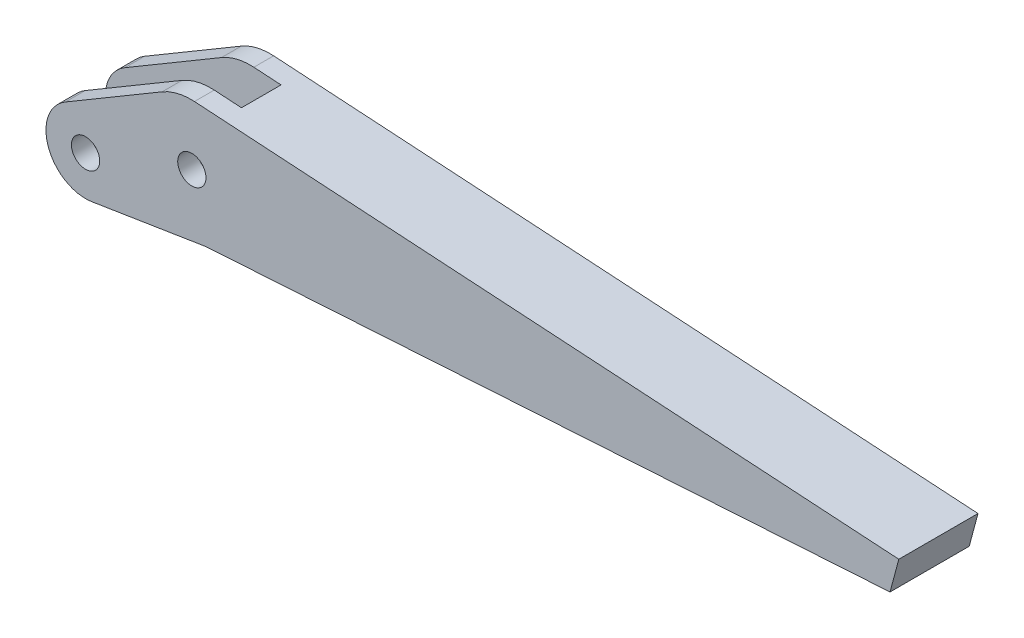
ISO-10303-21;
HEADER;
FILE_DESCRIPTION(('STEP AP214'),'2;1');
FILE_NAME('part.step','',(''),(''),'','','');
FILE_SCHEMA(('AUTOMOTIVE_DESIGN { 1 0 10303 214 1 1 1 1 }'));
ENDSEC;
DATA;
#1=APPLICATION_CONTEXT('core data for automotive mechanical design processes');
#2=APPLICATION_PROTOCOL_DEFINITION('international standard','automotive_design',2000,#1);
#3=PRODUCT_CONTEXT('',#1,'mechanical');
#4=PRODUCT('Part','Part','',(#3));
#5=PRODUCT_RELATED_PRODUCT_CATEGORY('part','',(#4));
#6=PRODUCT_DEFINITION_FORMATION('','',#4);
#7=PRODUCT_DEFINITION_CONTEXT('part definition',#1,'design');
#8=PRODUCT_DEFINITION('design','',#6,#7);
#9=PRODUCT_DEFINITION_SHAPE('','',#8);
#10=(LENGTH_UNIT() NAMED_UNIT(*) SI_UNIT(.MILLI.,.METRE.));
#11=(NAMED_UNIT(*) PLANE_ANGLE_UNIT() SI_UNIT($,.RADIAN.));
#12=(NAMED_UNIT(*) SI_UNIT($,.STERADIAN.) SOLID_ANGLE_UNIT());
#13=UNCERTAINTY_MEASURE_WITH_UNIT(LENGTH_MEASURE(1.E-05),#10,'distance_accuracy_value','');
#14=(GEOMETRIC_REPRESENTATION_CONTEXT(3) GLOBAL_UNCERTAINTY_ASSIGNED_CONTEXT((#13)) GLOBAL_UNIT_ASSIGNED_CONTEXT((#10,
#11,#12)) REPRESENTATION_CONTEXT('',''));
#15=CARTESIAN_POINT('',(0.,0.,0.));
#16=DIRECTION('',(0.,0.,1.));
#17=DIRECTION('',(1.,0.,0.));
#18=AXIS2_PLACEMENT_3D('',#15,#16,#17);
#19=CARTESIAN_POINT('',(-11.1776244543759,-0.407044657572463,7.));
#20=DIRECTION('',(0.508770927576245,-0.86090193590978,0.));
#21=DIRECTION('',(0.86090193590978,0.508770927576245,0.));
#22=AXIS2_PLACEMENT_3D('',#19,#20,#21);
#23=PLANE('',#22);
#24=DIRECTION('',(0.86090193590978,0.508770927576245,0.));
#25=VECTOR('',#24,1.);
#26=CARTESIAN_POINT('',(-11.1776244543759,-0.407044657572463,1.75));
#27=LINE('',#26,#25);
#28=CARTESIAN_POINT('',(-11.1776244543759,-0.407044657572463,1.75));
#29=VERTEX_POINT('',#28);
#30=CARTESIAN_POINT('',(-2.62599056397553,4.64675128042089,1.75));
#31=VERTEX_POINT('',#30);
#32=EDGE_CURVE('E177',#29,#31,#27,.T.);
#33=ORIENTED_EDGE('',*,*,#32,.T.);
#34=DIRECTION('',(0.,0.,-1.));
#35=VECTOR('',#34,1.);
#36=CARTESIAN_POINT('',(-2.62599056397554,4.64675128042089,7.));
#37=LINE('',#36,#35);
#38=CARTESIAN_POINT('',(-2.62599056397554,4.64675128042089,0.));
#39=VERTEX_POINT('',#38);
#40=EDGE_CURVE('E262',#31,#39,#37,.T.);
#41=ORIENTED_EDGE('',*,*,#40,.T.);
#42=DIRECTION('',(-0.86090193590978,-0.508770927576245,0.));
#43=VECTOR('',#42,1.);
#44=CARTESIAN_POINT('',(-11.1776244543759,-0.407044657572463,0.));
#45=LINE('',#44,#43);
#46=CARTESIAN_POINT('',(-11.1776244543759,-0.407044657572463,0.));
#47=VERTEX_POINT('',#46);
#48=EDGE_CURVE('E212',#39,#47,#45,.T.);
#49=ORIENTED_EDGE('',*,*,#48,.T.);
#50=DIRECTION('',(0.,0.,-1.));
#51=VECTOR('',#50,1.);
#52=CARTESIAN_POINT('',(-11.1776244543759,-0.407044657572463,7.));
#53=LINE('',#52,#51);
#54=EDGE_CURVE('E227',#29,#47,#53,.T.);
#55=ORIENTED_EDGE('',*,*,#54,.F.);
#56=EDGE_LOOP('',(#33,#41,#49,#55));
#57=FACE_BOUND('',#56,.T.);
#58=ADVANCED_FACE('F32',(#57),#23,.F.);
#59=CARTESIAN_POINT('',(-9.39692620785908,-3.42020143325669,7.));
#60=DIRECTION('',(0.,0.,-1.));
#61=DIRECTION('',(-1.,0.,0.));
#62=AXIS2_PLACEMENT_3D('',#59,#60,#61);
#63=CYLINDRICAL_SURFACE('',#62,3.5);
#64=DIRECTION('',(0.,0.,-1.));
#65=VECTOR('',#64,1.);
#66=CARTESIAN_POINT('',(-8.84684112469676,-6.8767034803098,7.));
#67=LINE('',#66,#65);
#68=CARTESIAN_POINT('',(-8.84684112469676,-6.8767034803098,1.75));
#69=VERTEX_POINT('',#68);
#70=CARTESIAN_POINT('',(-8.84684112469676,-6.8767034803098,0.));
#71=VERTEX_POINT('',#70);
#72=EDGE_CURVE('E223',#69,#71,#67,.T.);
#73=ORIENTED_EDGE('',*,*,#72,.F.);
#74=CARTESIAN_POINT('',(-9.39692620785908,-3.42020143325669,1.75));
#75=DIRECTION('',(0.,0.,-1.));
#76=DIRECTION('',(-1.,0.,0.));
#77=AXIS2_PLACEMENT_3D('',#74,#75,#76);
#78=CIRCLE('',#77,3.5);
#79=EDGE_CURVE('E295',#69,#29,#78,.T.);
#80=ORIENTED_EDGE('',*,*,#79,.T.);
#81=ORIENTED_EDGE('',*,*,#54,.T.);
#82=CARTESIAN_POINT('',(-9.39692620785908,-3.42020143325669,0.));
#83=DIRECTION('',(0.,0.,1.));
#84=DIRECTION('',(1.,0.,0.));
#85=AXIS2_PLACEMENT_3D('',#82,#83,#84);
#86=CIRCLE('',#85,3.5);
#87=EDGE_CURVE('E214',#47,#71,#86,.T.);
#88=ORIENTED_EDGE('',*,*,#87,.T.);
#89=EDGE_LOOP('',(#73,#80,#81,#88));
#90=FACE_BOUND('',#89,.T.);
#91=ADVANCED_FACE('F340',(#90),#63,.T.);
#92=CARTESIAN_POINT('',(1.26418836332578,-5.26758350263832,7.));
#93=DIRECTION('',(-0.157167166617804,0.987572013443744,0.));
#94=DIRECTION('',(-0.987572013443745,-0.157167166617804,0.));
#95=AXIS2_PLACEMENT_3D('',#92,#93,#94);
#96=PLANE('',#95);
#97=DIRECTION('',(0.987572013443744,0.157167166617804,0.));
#98=VECTOR('',#97,1.);
#99=CARTESIAN_POINT('',(1.26418836332578,-5.26758350263832,0.));
#100=LINE('',#99,#98);
#101=CARTESIAN_POINT('',(1.029108184364,-5.30499534213202,0.));
#102=VERTEX_POINT('',#101);
#103=EDGE_CURVE('E217',#71,#102,#100,.T.);
#104=ORIENTED_EDGE('',*,*,#103,.T.);
#105=DIRECTION('',(0.,0.,-1.));
#106=VECTOR('',#105,1.);
#107=CARTESIAN_POINT('',(1.029108184364,-5.30499534213202,1.75));
#108=LINE('',#107,#106);
#109=CARTESIAN_POINT('',(1.029108184364,-5.30499534213202,1.75));
#110=VERTEX_POINT('',#109);
#111=EDGE_CURVE('E250',#102,#110,#108,.F.);
#112=ORIENTED_EDGE('',*,*,#111,.T.);
#113=DIRECTION('',(-0.987572013443744,-0.157167166617804,0.));
#114=VECTOR('',#113,1.);
#115=CARTESIAN_POINT('',(1.26418836332578,-5.26758350263832,1.75));
#116=LINE('',#115,#114);
#117=EDGE_CURVE('E290',#110,#69,#116,.T.);
#118=ORIENTED_EDGE('',*,*,#117,.T.);
#119=ORIENTED_EDGE('',*,*,#72,.T.);
#120=EDGE_LOOP('',(#104,#112,#118,#119));
#121=FACE_BOUND('',#120,.T.);
#122=ADVANCED_FACE('F281',(#121),#96,.F.);
#123=CARTESIAN_POINT('',(0.,0.,7.));
#124=DIRECTION('',(0.,0.,-1.));
#125=DIRECTION('',(-1.,0.,0.));
#126=AXIS2_PLACEMENT_3D('',#123,#124,#125);
#127=CYLINDRICAL_SURFACE('',#126,1.25);
#128=CARTESIAN_POINT('',(0.,0.,1.75));
#129=DIRECTION('',(0.,0.,-1.));
#130=DIRECTION('',(-1.,0.,0.));
#131=AXIS2_PLACEMENT_3D('',#128,#129,#130);
#132=CIRCLE('',#131,1.25);
#133=CARTESIAN_POINT('',(-1.25,0.,1.75));
#134=VERTEX_POINT('',#133);
#135=EDGE_CURVE('E240',#134,#134,#132,.T.);
#136=ORIENTED_EDGE('',*,*,#135,.F.);
#137=EDGE_LOOP('',(#136));
#138=FACE_BOUND('',#137,.T.);
#139=CARTESIAN_POINT('',(0.,0.,0.));
#140=DIRECTION('',(0.,0.,1.));
#141=DIRECTION('',(1.,0.,0.));
#142=AXIS2_PLACEMENT_3D('',#139,#140,#141);
#143=CIRCLE('',#142,1.25);
#144=CARTESIAN_POINT('',(1.25,0.,0.));
#145=VERTEX_POINT('',#144);
#146=EDGE_CURVE('E182',#145,#145,#143,.T.);
#147=ORIENTED_EDGE('',*,*,#146,.F.);
#148=EDGE_LOOP('',(#147));
#149=FACE_BOUND('',#148,.T.);
#150=ADVANCED_FACE('F347',(#138,#149),#127,.F.);
#151=CARTESIAN_POINT('',(-9.39692620785908,-3.42020143325669,7.));
#152=DIRECTION('',(0.,0.,-1.));
#153=DIRECTION('',(-1.,0.,0.));
#154=AXIS2_PLACEMENT_3D('',#151,#152,#153);
#155=CYLINDRICAL_SURFACE('',#154,1.25);
#156=CARTESIAN_POINT('',(-9.39692620785908,-3.42020143325669,1.75));
#157=DIRECTION('',(0.,0.,-1.));
#158=DIRECTION('',(-1.,0.,0.));
#159=AXIS2_PLACEMENT_3D('',#156,#157,#158);
#160=CIRCLE('',#159,1.25);
#161=CARTESIAN_POINT('',(-10.6469262078591,-3.42020143325669,1.75));
#162=VERTEX_POINT('',#161);
#163=EDGE_CURVE('E157',#162,#162,#160,.T.);
#164=ORIENTED_EDGE('',*,*,#163,.F.);
#165=EDGE_LOOP('',(#164));
#166=FACE_BOUND('',#165,.T.);
#167=CARTESIAN_POINT('',(-9.39692620785908,-3.42020143325669,0.));
#168=DIRECTION('',(0.,0.,1.));
#169=DIRECTION('',(1.,0.,0.));
#170=AXIS2_PLACEMENT_3D('',#167,#168,#169);
#171=CIRCLE('',#170,1.25);
#172=CARTESIAN_POINT('',(-8.14692620785908,-3.42020143325669,0.));
#173=VERTEX_POINT('',#172);
#174=EDGE_CURVE('E172',#173,#173,#171,.T.);
#175=ORIENTED_EDGE('',*,*,#174,.F.);
#176=EDGE_LOOP('',(#175));
#177=FACE_BOUND('',#176,.T.);
#178=ADVANCED_FACE('F458',(#166,#177),#155,.F.);
#179=CARTESIAN_POINT('',(-9.39692620785908,-3.42020143325669,7.));
#180=DIRECTION('',(0.,0.,1.));
#181=DIRECTION('',(1.,0.,0.));
#182=AXIS2_PLACEMENT_3D('',#179,#180,#181);
#183=PLANE('',#182);
#184=CARTESIAN_POINT('',(0.,0.,7.));
#185=DIRECTION('',(0.,0.,1.));
#186=DIRECTION('',(1.,0.,0.));
#187=AXIS2_PLACEMENT_3D('',#184,#185,#186);
#188=CIRCLE('',#187,1.25);
#189=CARTESIAN_POINT('',(1.25,0.,7.));
#190=VERTEX_POINT('',#189);
#191=EDGE_CURVE('E184',#190,#190,#188,.T.);
#192=ORIENTED_EDGE('',*,*,#191,.F.);
#193=EDGE_LOOP('',(#192));
#194=FACE_BOUND('',#193,.T.);
#195=DIRECTION('',(-0.998036380819376,0.0626369105317367,0.));
#196=VECTOR('',#195,1.);
#197=CARTESIAN_POINT('',(-1.30285329364713,5.42869141582585,7.));
#198=LINE('',#197,#196);
#199=CARTESIAN_POINT('',(62.4982707345716,1.42452345724016,7.));
#200=VERTEX_POINT('',#199);
#201=CARTESIAN_POINT('',(0.231048626564367,5.33242350496887,7.));
#202=VERTEX_POINT('',#201);
#203=EDGE_CURVE('E193',#200,#202,#198,.T.);
#204=ORIENTED_EDGE('',*,*,#203,.T.);
#205=CARTESIAN_POINT('',(-0.0821359260943164,0.342241600871988,7.));
#206=DIRECTION('',(0.,0.,1.));
#207=DIRECTION('',(1.,0.,0.));
#208=AXIS2_PLACEMENT_3D('',#205,#206,#207);
#209=CIRCLE('',#208,5.);
#210=CARTESIAN_POINT('',(-2.62599056397554,4.64675128042089,7.));
#211=VERTEX_POINT('',#210);
#212=EDGE_CURVE('E260',#202,#211,#209,.T.);
#213=ORIENTED_EDGE('',*,*,#212,.T.);
#214=DIRECTION('',(-0.86090193590978,-0.508770927576245,0.));
#215=VECTOR('',#214,1.);
#216=CARTESIAN_POINT('',(-11.1776244543759,-0.407044657572463,7.));
#217=LINE('',#216,#215);
#218=CARTESIAN_POINT('',(-11.1776244543759,-0.407044657572463,7.));
#219=VERTEX_POINT('',#218);
#220=EDGE_CURVE('E197',#211,#219,#217,.T.);
#221=ORIENTED_EDGE('',*,*,#220,.T.);
#222=CARTESIAN_POINT('',(-9.39692620785908,-3.42020143325669,7.));
#223=DIRECTION('',(0.,0.,1.));
#224=DIRECTION('',(1.,0.,0.));
#225=AXIS2_PLACEMENT_3D('',#222,#223,#224);
#226=CIRCLE('',#225,3.5);
#227=CARTESIAN_POINT('',(-8.84684112469676,-6.8767034803098,7.));
#228=VERTEX_POINT('',#227);
#229=EDGE_CURVE('E199',#219,#228,#226,.T.);
#230=ORIENTED_EDGE('',*,*,#229,.T.);
#231=DIRECTION('',(0.987572013443744,0.157167166617804,0.));
#232=VECTOR('',#231,1.);
#233=CARTESIAN_POINT('',(1.26418836332578,-5.26758350263832,7.));
#234=LINE('',#233,#232);
#235=CARTESIAN_POINT('',(1.029108184364,-5.30499534213202,7.));
#236=VERTEX_POINT('',#235);
#237=EDGE_CURVE('E201',#228,#236,#234,.T.);
#238=ORIENTED_EDGE('',*,*,#237,.T.);
#239=CARTESIAN_POINT('',(1.81494401745302,-10.2428554093507,7.));
#240=DIRECTION('',(0.,0.,1.));
#241=DIRECTION('',(1.,0.,0.));
#242=AXIS2_PLACEMENT_3D('',#239,#240,#241);
#243=CIRCLE('',#242,5.);
#244=CARTESIAN_POINT('',(1.50175946479433,-5.25267350525386,7.));
#245=VERTEX_POINT('',#244);
#246=EDGE_CURVE('E268',#236,#245,#243,.F.);
#247=ORIENTED_EDGE('',*,*,#246,.T.);
#248=DIRECTION('',(0.998036380819376,0.0626369105317371,0.));
#249=VECTOR('',#248,1.);
#250=CARTESIAN_POINT('',(61.7218135992641,-1.47325402162705,7.));
#251=LINE('',#250,#249);
#252=CARTESIAN_POINT('',(61.7218135992641,-1.47325402162705,7.));
#253=VERTEX_POINT('',#252);
#254=EDGE_CURVE('E204',#245,#253,#251,.T.);
#255=ORIENTED_EDGE('',*,*,#254,.T.);
#256=DIRECTION('',(0.258819045102517,0.965925826289069,0.));
#257=VECTOR('',#256,1.);
#258=CARTESIAN_POINT('',(62.4982707345716,1.42452345724016,7.));
#259=LINE('',#258,#257);
#260=EDGE_CURVE('E190',#253,#200,#259,.T.);
#261=ORIENTED_EDGE('',*,*,#260,.T.);
#262=EDGE_LOOP('',(#204,#213,#221,#230,#238,#247,#255,#261));
#263=FACE_BOUND('',#262,.T.);
#264=CARTESIAN_POINT('',(-9.39692620785908,-3.42020143325669,7.));
#265=DIRECTION('',(0.,0.,1.));
#266=DIRECTION('',(1.,0.,0.));
#267=AXIS2_PLACEMENT_3D('',#264,#265,#266);
#268=CIRCLE('',#267,1.25);
#269=CARTESIAN_POINT('',(-8.14692620785908,-3.42020143325669,7.));
#270=VERTEX_POINT('',#269);
#271=EDGE_CURVE('E175',#270,#270,#268,.T.);
#272=ORIENTED_EDGE('',*,*,#271,.F.);
#273=EDGE_LOOP('',(#272));
#274=FACE_BOUND('',#273,.T.);
#275=ADVANCED_FACE('F328',(#194,#263,#274),#183,.T.);
#276=CARTESIAN_POINT('',(-9.39692620785908,-3.42020143325669,0.));
#277=DIRECTION('',(0.,0.,1.));
#278=DIRECTION('',(1.,0.,0.));
#279=AXIS2_PLACEMENT_3D('',#276,#277,#278);
#280=PLANE('',#279);
#281=ORIENTED_EDGE('',*,*,#146,.T.);
#282=EDGE_LOOP('',(#281));
#283=FACE_BOUND('',#282,.T.);
#284=ORIENTED_EDGE('',*,*,#48,.F.);
#285=CARTESIAN_POINT('',(-0.0821359260943164,0.342241600871988,0.));
#286=DIRECTION('',(0.,0.,1.));
#287=DIRECTION('',(1.,0.,0.));
#288=AXIS2_PLACEMENT_3D('',#285,#286,#287);
#289=CIRCLE('',#288,5.);
#290=CARTESIAN_POINT('',(0.231048626564367,5.33242350496887,0.));
#291=VERTEX_POINT('',#290);
#292=EDGE_CURVE('E47',#39,#291,#289,.F.);
#293=ORIENTED_EDGE('',*,*,#292,.T.);
#294=DIRECTION('',(-0.998036380819376,0.0626369105317367,0.));
#295=VECTOR('',#294,1.);
#296=CARTESIAN_POINT('',(-1.30285329364713,5.42869141582585,0.));
#297=LINE('',#296,#295);
#298=CARTESIAN_POINT('',(62.4982707345716,1.42452345724016,0.));
#299=VERTEX_POINT('',#298);
#300=EDGE_CURVE('E209',#299,#291,#297,.T.);
#301=ORIENTED_EDGE('',*,*,#300,.F.);
#302=DIRECTION('',(0.258819045102517,0.965925826289069,0.));
#303=VECTOR('',#302,1.);
#304=CARTESIAN_POINT('',(62.4982707345716,1.42452345724016,0.));
#305=LINE('',#304,#303);
#306=CARTESIAN_POINT('',(61.7218135992641,-1.47325402162705,0.));
#307=VERTEX_POINT('',#306);
#308=EDGE_CURVE('E187',#307,#299,#305,.T.);
#309=ORIENTED_EDGE('',*,*,#308,.F.);
#310=DIRECTION('',(0.998036380819376,0.0626369105317371,0.));
#311=VECTOR('',#310,1.);
#312=CARTESIAN_POINT('',(61.7218135992641,-1.47325402162705,0.));
#313=LINE('',#312,#311);
#314=CARTESIAN_POINT('',(1.50175946479433,-5.25267350525386,0.));
#315=VERTEX_POINT('',#314);
#316=EDGE_CURVE('E194',#315,#307,#313,.T.);
#317=ORIENTED_EDGE('',*,*,#316,.F.);
#318=CARTESIAN_POINT('',(1.81494401745302,-10.2428554093507,0.));
#319=DIRECTION('',(0.,0.,1.));
#320=DIRECTION('',(1.,0.,0.));
#321=AXIS2_PLACEMENT_3D('',#318,#319,#320);
#322=CIRCLE('',#321,5.);
#323=EDGE_CURVE('E40',#315,#102,#322,.T.);
#324=ORIENTED_EDGE('',*,*,#323,.T.);
#325=ORIENTED_EDGE('',*,*,#103,.F.);
#326=ORIENTED_EDGE('',*,*,#87,.F.);
#327=EDGE_LOOP('',(#284,#293,#301,#309,#317,#324,#325,#326));
#328=FACE_BOUND('',#327,.T.);
#329=ORIENTED_EDGE('',*,*,#174,.T.);
#330=EDGE_LOOP('',(#329));
#331=FACE_BOUND('',#330,.T.);
#332=ADVANCED_FACE('F273',(#283,#328,#331),#280,.F.);
#333=CARTESIAN_POINT('',(62.4982707345716,1.42452345724016,7.));
#334=DIRECTION('',(-0.965925826289069,0.258819045102517,0.));
#335=DIRECTION('',(-0.258819045102517,-0.965925826289069,0.));
#336=AXIS2_PLACEMENT_3D('',#333,#334,#335);
#337=PLANE('',#336);
#338=ORIENTED_EDGE('',*,*,#308,.T.);
#339=DIRECTION('',(0.,0.,-1.));
#340=VECTOR('',#339,1.);
#341=CARTESIAN_POINT('',(62.4982707345716,1.42452345724016,7.));
#342=LINE('',#341,#340);
#343=EDGE_CURVE('E231',#200,#299,#342,.T.);
#344=ORIENTED_EDGE('',*,*,#343,.F.);
#345=ORIENTED_EDGE('',*,*,#260,.F.);
#346=DIRECTION('',(0.,0.,-1.));
#347=VECTOR('',#346,1.);
#348=CARTESIAN_POINT('',(61.7218135992641,-1.47325402162705,7.));
#349=LINE('',#348,#347);
#350=EDGE_CURVE('E206',#253,#307,#349,.T.);
#351=ORIENTED_EDGE('',*,*,#350,.T.);
#352=EDGE_LOOP('',(#338,#344,#345,#351));
#353=FACE_BOUND('',#352,.T.);
#354=ADVANCED_FACE('F338',(#353),#337,.F.);
#355=CARTESIAN_POINT('',(-1.30285329364713,5.42869141582585,7.));
#356=DIRECTION('',(-0.0626369105317367,-0.998036380819376,0.));
#357=DIRECTION('',(0.998036380819377,-0.0626369105317367,0.));
#358=AXIS2_PLACEMENT_3D('',#355,#356,#357);
#359=PLANE('',#358);
#360=DIRECTION('',(-0.998036380819376,0.0626369105317367,0.));
#361=VECTOR('',#360,1.);
#362=CARTESIAN_POINT('',(-1.30285329364713,5.42869141582585,5.25));
#363=LINE('',#362,#361);
#364=CARTESIAN_POINT('',(2.63686780874126,5.18143393808972,5.25));
#365=VERTEX_POINT('',#364);
#366=CARTESIAN_POINT('',(0.231048626564367,5.33242350496887,5.25));
#367=VERTEX_POINT('',#366);
#368=EDGE_CURVE('E146',#365,#367,#363,.T.);
#369=ORIENTED_EDGE('',*,*,#368,.T.);
#370=DIRECTION('',(0.,0.,-1.));
#371=VECTOR('',#370,1.);
#372=CARTESIAN_POINT('',(0.231048626564367,5.33242350496887,7.));
#373=LINE('',#372,#371);
#374=EDGE_CURVE('E258',#367,#202,#373,.F.);
#375=ORIENTED_EDGE('',*,*,#374,.T.);
#376=ORIENTED_EDGE('',*,*,#203,.F.);
#377=ORIENTED_EDGE('',*,*,#343,.T.);
#378=ORIENTED_EDGE('',*,*,#300,.T.);
#379=DIRECTION('',(0.,0.,-1.));
#380=VECTOR('',#379,1.);
#381=CARTESIAN_POINT('',(0.231048626564367,5.33242350496887,7.));
#382=LINE('',#381,#380);
#383=CARTESIAN_POINT('',(0.231048626564367,5.33242350496887,1.75));
#384=VERTEX_POINT('',#383);
#385=EDGE_CURVE('E256',#291,#384,#382,.F.);
#386=ORIENTED_EDGE('',*,*,#385,.T.);
#387=DIRECTION('',(0.998036380819376,-0.0626369105317367,0.));
#388=VECTOR('',#387,1.);
#389=CARTESIAN_POINT('',(-1.30285329364713,5.42869141582585,1.75));
#390=LINE('',#389,#388);
#391=CARTESIAN_POINT('',(2.63686780874126,5.18143393808972,1.75));
#392=VERTEX_POINT('',#391);
#393=EDGE_CURVE('E171',#384,#392,#390,.T.);
#394=ORIENTED_EDGE('',*,*,#393,.T.);
#395=DIRECTION('',(0.,0.,1.));
#396=VECTOR('',#395,1.);
#397=CARTESIAN_POINT('',(2.63686780874126,5.18143393808972,7.));
#398=LINE('',#397,#396);
#399=EDGE_CURVE('E164',#392,#365,#398,.T.);
#400=ORIENTED_EDGE('',*,*,#399,.T.);
#401=EDGE_LOOP('',(#369,#375,#376,#377,#378,#386,#394,#400));
#402=FACE_BOUND('',#401,.T.);
#403=ADVANCED_FACE('F170',(#402),#359,.F.);
#404=ORIENTED_EDGE('',*,*,#220,.F.);
#405=DIRECTION('',(0.,0.,-1.));
#406=VECTOR('',#405,1.);
#407=CARTESIAN_POINT('',(-2.62599056397554,4.64675128042089,7.));
#408=LINE('',#407,#406);
#409=CARTESIAN_POINT('',(-2.62599056397553,4.64675128042089,5.25));
#410=VERTEX_POINT('',#409);
#411=EDGE_CURVE('E252',#211,#410,#408,.T.);
#412=ORIENTED_EDGE('',*,*,#411,.T.);
#413=DIRECTION('',(-0.86090193590978,-0.508770927576245,0.));
#414=VECTOR('',#413,1.);
#415=CARTESIAN_POINT('',(-11.1776244543759,-0.407044657572463,5.25));
#416=LINE('',#415,#414);
#417=CARTESIAN_POINT('',(-11.1776244543759,-0.407044657572463,5.25));
#418=VERTEX_POINT('',#417);
#419=EDGE_CURVE('E158',#410,#418,#416,.T.);
#420=ORIENTED_EDGE('',*,*,#419,.T.);
#421=EDGE_CURVE('E228',#219,#418,#53,.T.);
#422=ORIENTED_EDGE('',*,*,#421,.F.);
#423=EDGE_LOOP('',(#404,#412,#420,#422));
#424=FACE_BOUND('',#423,.T.);
#425=ADVANCED_FACE('F320',(#424),#23,.F.);
#426=ORIENTED_EDGE('',*,*,#421,.T.);
#427=CARTESIAN_POINT('',(-9.39692620785908,-3.42020143325669,5.25));
#428=DIRECTION('',(0.,0.,1.));
#429=DIRECTION('',(1.,0.,0.));
#430=AXIS2_PLACEMENT_3D('',#427,#428,#429);
#431=CIRCLE('',#430,3.5);
#432=CARTESIAN_POINT('',(-8.84684112469676,-6.8767034803098,5.25));
#433=VERTEX_POINT('',#432);
#434=EDGE_CURVE('E313',#418,#433,#431,.T.);
#435=ORIENTED_EDGE('',*,*,#434,.T.);
#436=EDGE_CURVE('E224',#228,#433,#67,.T.);
#437=ORIENTED_EDGE('',*,*,#436,.F.);
#438=ORIENTED_EDGE('',*,*,#229,.F.);
#439=EDGE_LOOP('',(#426,#435,#437,#438));
#440=FACE_BOUND('',#439,.T.);
#441=ADVANCED_FACE('F325',(#440),#63,.T.);
#442=DIRECTION('',(0.987572013443744,0.157167166617804,0.));
#443=VECTOR('',#442,1.);
#444=CARTESIAN_POINT('',(1.26418836332578,-5.26758350263832,5.25));
#445=LINE('',#444,#443);
#446=CARTESIAN_POINT('',(1.029108184364,-5.30499534213202,5.25));
#447=VERTEX_POINT('',#446);
#448=EDGE_CURVE('E310',#433,#447,#445,.T.);
#449=ORIENTED_EDGE('',*,*,#448,.T.);
#450=DIRECTION('',(0.,0.,-1.));
#451=VECTOR('',#450,1.);
#452=CARTESIAN_POINT('',(1.029108184364,-5.30499534213202,7.));
#453=LINE('',#452,#451);
#454=EDGE_CURVE('E248',#447,#236,#453,.F.);
#455=ORIENTED_EDGE('',*,*,#454,.T.);
#456=ORIENTED_EDGE('',*,*,#237,.F.);
#457=ORIENTED_EDGE('',*,*,#436,.T.);
#458=EDGE_LOOP('',(#449,#455,#456,#457));
#459=FACE_BOUND('',#458,.T.);
#460=ADVANCED_FACE('F349',(#459),#96,.F.);
#461=CARTESIAN_POINT('',(61.7218135992641,-1.47325402162705,7.));
#462=DIRECTION('',(-0.0626369105317371,0.998036380819376,0.));
#463=DIRECTION('',(-0.998036380819376,-0.0626369105317371,0.));
#464=AXIS2_PLACEMENT_3D('',#461,#462,#463);
#465=PLANE('',#464);
#466=ORIENTED_EDGE('',*,*,#254,.F.);
#467=DIRECTION('',(0.,0.,-1.));
#468=VECTOR('',#467,1.);
#469=CARTESIAN_POINT('',(1.50175946479434,-5.25267350525386,5.25));
#470=LINE('',#469,#468);
#471=CARTESIAN_POINT('',(1.50175946479431,-5.25267350525387,5.25));
#472=VERTEX_POINT('',#471);
#473=EDGE_CURVE('E245',#245,#472,#470,.T.);
#474=ORIENTED_EDGE('',*,*,#473,.T.);
#475=DIRECTION('',(0.998036380819377,0.0626369105317371,0.));
#476=VECTOR('',#475,1.);
#477=CARTESIAN_POINT('',(61.7218135992641,-1.47325402162705,5.24999999999999));
#478=LINE('',#477,#476);
#479=CARTESIAN_POINT('',(6.32440938807595,-4.95000328443238,5.25));
#480=VERTEX_POINT('',#479);
#481=EDGE_CURVE('E308',#472,#480,#478,.T.);
#482=ORIENTED_EDGE('',*,*,#481,.T.);
#483=DIRECTION('',(0.,0.,-1.));
#484=VECTOR('',#483,1.);
#485=CARTESIAN_POINT('',(6.32440938807596,-4.95000328443238,7.));
#486=LINE('',#485,#484);
#487=CARTESIAN_POINT('',(6.32440938807595,-4.95000328443238,1.75));
#488=VERTEX_POINT('',#487);
#489=EDGE_CURVE('E167',#480,#488,#486,.T.);
#490=ORIENTED_EDGE('',*,*,#489,.T.);
#491=DIRECTION('',(-0.998036380819377,-0.0626369105317371,0.));
#492=VECTOR('',#491,1.);
#493=CARTESIAN_POINT('',(61.7218135992641,-1.47325402162705,1.74999999999999));
#494=LINE('',#493,#492);
#495=CARTESIAN_POINT('',(1.50175946479431,-5.25267350525387,1.75));
#496=VERTEX_POINT('',#495);
#497=EDGE_CURVE('E288',#488,#496,#494,.T.);
#498=ORIENTED_EDGE('',*,*,#497,.T.);
#499=DIRECTION('',(0.,0.,-1.));
#500=VECTOR('',#499,1.);
#501=CARTESIAN_POINT('',(1.50175946479434,-5.25267350525386,0.));
#502=LINE('',#501,#500);
#503=EDGE_CURVE('E242',#496,#315,#502,.T.);
#504=ORIENTED_EDGE('',*,*,#503,.T.);
#505=ORIENTED_EDGE('',*,*,#316,.T.);
#506=ORIENTED_EDGE('',*,*,#350,.F.);
#507=EDGE_LOOP('',(#466,#474,#482,#490,#498,#504,#505,#506));
#508=FACE_BOUND('',#507,.T.);
#509=ADVANCED_FACE('F293',(#508),#465,.F.);
#510=CARTESIAN_POINT('',(0.,0.,5.25));
#511=DIRECTION('',(0.,0.,1.));
#512=DIRECTION('',(1.,0.,0.));
#513=AXIS2_PLACEMENT_3D('',#510,#511,#512);
#514=CIRCLE('',#513,1.25);
#515=CARTESIAN_POINT('',(1.25,0.,5.25));
#516=VERTEX_POINT('',#515);
#517=EDGE_CURVE('E237',#516,#516,#514,.T.);
#518=ORIENTED_EDGE('',*,*,#517,.F.);
#519=EDGE_LOOP('',(#518));
#520=FACE_BOUND('',#519,.T.);
#521=ORIENTED_EDGE('',*,*,#191,.T.);
#522=EDGE_LOOP('',(#521));
#523=FACE_BOUND('',#522,.T.);
#524=ADVANCED_FACE('F420',(#520,#523),#127,.F.);
#525=CARTESIAN_POINT('',(-9.39692620785908,-3.42020143325669,5.25));
#526=DIRECTION('',(0.,0.,1.));
#527=DIRECTION('',(1.,0.,0.));
#528=AXIS2_PLACEMENT_3D('',#525,#526,#527);
#529=CIRCLE('',#528,1.25);
#530=CARTESIAN_POINT('',(-8.14692620785908,-3.42020143325669,5.25));
#531=VERTEX_POINT('',#530);
#532=EDGE_CURVE('E234',#531,#531,#529,.T.);
#533=ORIENTED_EDGE('',*,*,#532,.F.);
#534=EDGE_LOOP('',(#533));
#535=FACE_BOUND('',#534,.T.);
#536=ORIENTED_EDGE('',*,*,#271,.T.);
#537=EDGE_LOOP('',(#536));
#538=FACE_BOUND('',#537,.T.);
#539=ADVANCED_FACE('F482',(#535,#538),#155,.F.);
#540=CARTESIAN_POINT('',(13.5287123741601,-24.7436630616082,5.25));
#541=DIRECTION('',(0.939692620785908,0.342020143325669,0.));
#542=DIRECTION('',(-0.342020143325669,0.939692620785908,0.));
#543=AXIS2_PLACEMENT_3D('',#540,#541,#542);
#544=PLANE('',#543);
#545=DIRECTION('',(-0.342020143325669,0.939692620785908,0.));
#546=VECTOR('',#545,1.);
#547=CARTESIAN_POINT('',(13.5287123741601,-24.7436630616082,1.75));
#548=LINE('',#547,#546);
#549=EDGE_CURVE('E168',#488,#392,#548,.T.);
#550=ORIENTED_EDGE('',*,*,#549,.F.);
#551=ORIENTED_EDGE('',*,*,#489,.F.);
#552=DIRECTION('',(-0.342020143325669,0.939692620785908,0.));
#553=VECTOR('',#552,1.);
#554=CARTESIAN_POINT('',(13.5287123741601,-24.7436630616082,5.25));
#555=LINE('',#554,#553);
#556=EDGE_CURVE('E151',#480,#365,#555,.T.);
#557=ORIENTED_EDGE('',*,*,#556,.T.);
#558=ORIENTED_EDGE('',*,*,#399,.F.);
#559=EDGE_LOOP('',(#550,#551,#557,#558));
#560=FACE_BOUND('',#559,.T.);
#561=ADVANCED_FACE('F163',(#560),#544,.F.);
#562=CARTESIAN_POINT('',(13.5287123741601,-24.7436630616082,1.75));
#563=DIRECTION('',(0.,0.,-1.));
#564=DIRECTION('',(-1.,0.,0.));
#565=AXIS2_PLACEMENT_3D('',#562,#563,#564);
#566=PLANE('',#565);
#567=ORIENTED_EDGE('',*,*,#163,.T.);
#568=EDGE_LOOP('',(#567));
#569=FACE_BOUND('',#568,.T.);
#570=ORIENTED_EDGE('',*,*,#135,.T.);
#571=EDGE_LOOP('',(#570));
#572=FACE_BOUND('',#571,.T.);
#573=ORIENTED_EDGE('',*,*,#393,.F.);
#574=CARTESIAN_POINT('',(-0.0821359260943164,0.342241600871988,1.75));
#575=DIRECTION('',(0.,0.,-1.));
#576=DIRECTION('',(-1.,0.,0.));
#577=AXIS2_PLACEMENT_3D('',#574,#575,#576);
#578=CIRCLE('',#577,5.);
#579=EDGE_CURVE('E55',#384,#31,#578,.F.);
#580=ORIENTED_EDGE('',*,*,#579,.T.);
#581=ORIENTED_EDGE('',*,*,#32,.F.);
#582=ORIENTED_EDGE('',*,*,#79,.F.);
#583=ORIENTED_EDGE('',*,*,#117,.F.);
#584=CARTESIAN_POINT('',(1.81494401745302,-10.2428554093507,1.75));
#585=DIRECTION('',(0.,0.,-1.));
#586=DIRECTION('',(-1.,0.,0.));
#587=AXIS2_PLACEMENT_3D('',#584,#585,#586);
#588=CIRCLE('',#587,5.);
#589=EDGE_CURVE('E11',#110,#496,#588,.T.);
#590=ORIENTED_EDGE('',*,*,#589,.T.);
#591=ORIENTED_EDGE('',*,*,#497,.F.);
#592=ORIENTED_EDGE('',*,*,#549,.T.);
#593=EDGE_LOOP('',(#573,#580,#581,#582,#583,#590,#591,#592));
#594=FACE_BOUND('',#593,.T.);
#595=ADVANCED_FACE('F287',(#569,#572,#594),#566,.F.);
#596=CARTESIAN_POINT('',(13.5287123741601,-24.7436630616082,5.25));
#597=DIRECTION('',(0.,0.,1.));
#598=DIRECTION('',(1.,0.,0.));
#599=AXIS2_PLACEMENT_3D('',#596,#597,#598);
#600=PLANE('',#599);
#601=ORIENTED_EDGE('',*,*,#532,.T.);
#602=EDGE_LOOP('',(#601));
#603=FACE_BOUND('',#602,.T.);
#604=ORIENTED_EDGE('',*,*,#517,.T.);
#605=EDGE_LOOP('',(#604));
#606=FACE_BOUND('',#605,.T.);
#607=ORIENTED_EDGE('',*,*,#419,.F.);
#608=CARTESIAN_POINT('',(-0.0821359260943164,0.342241600871988,5.25));
#609=DIRECTION('',(0.,0.,1.));
#610=DIRECTION('',(1.,0.,0.));
#611=AXIS2_PLACEMENT_3D('',#608,#609,#610);
#612=CIRCLE('',#611,5.);
#613=EDGE_CURVE('E153',#410,#367,#612,.F.);
#614=ORIENTED_EDGE('',*,*,#613,.T.);
#615=ORIENTED_EDGE('',*,*,#368,.F.);
#616=ORIENTED_EDGE('',*,*,#556,.F.);
#617=ORIENTED_EDGE('',*,*,#481,.F.);
#618=CARTESIAN_POINT('',(1.81494401745302,-10.2428554093507,5.25));
#619=DIRECTION('',(0.,0.,1.));
#620=DIRECTION('',(1.,0.,0.));
#621=AXIS2_PLACEMENT_3D('',#618,#619,#620);
#622=CIRCLE('',#621,5.);
#623=EDGE_CURVE('E266',#472,#447,#622,.T.);
#624=ORIENTED_EDGE('',*,*,#623,.T.);
#625=ORIENTED_EDGE('',*,*,#448,.F.);
#626=ORIENTED_EDGE('',*,*,#434,.F.);
#627=EDGE_LOOP('',(#607,#614,#615,#616,#617,#624,#625,#626));
#628=FACE_BOUND('',#627,.T.);
#629=ADVANCED_FACE('F149',(#603,#606,#628),#600,.F.);
#630=CARTESIAN_POINT('',(1.81494401745302,-10.2428554093507,7.));
#631=DIRECTION('',(0.,0.,1.));
#632=DIRECTION('',(1.,0.,0.));
#633=AXIS2_PLACEMENT_3D('',#630,#631,#632);
#634=CYLINDRICAL_SURFACE('',#633,5.);
#635=ORIENTED_EDGE('',*,*,#246,.F.);
#636=ORIENTED_EDGE('',*,*,#454,.F.);
#637=ORIENTED_EDGE('',*,*,#623,.F.);
#638=ORIENTED_EDGE('',*,*,#473,.F.);
#639=EDGE_LOOP('',(#635,#636,#637,#638));
#640=FACE_BOUND('',#639,.T.);
#641=ADVANCED_FACE('F364',(#640),#634,.F.);
#642=CARTESIAN_POINT('',(1.81494401745302,-10.2428554093507,7.));
#643=DIRECTION('',(0.,0.,1.));
#644=DIRECTION('',(1.,0.,0.));
#645=AXIS2_PLACEMENT_3D('',#642,#643,#644);
#646=CYLINDRICAL_SURFACE('',#645,5.);
#647=ORIENTED_EDGE('',*,*,#589,.F.);
#648=ORIENTED_EDGE('',*,*,#111,.F.);
#649=ORIENTED_EDGE('',*,*,#323,.F.);
#650=ORIENTED_EDGE('',*,*,#503,.F.);
#651=EDGE_LOOP('',(#647,#648,#649,#650));
#652=FACE_BOUND('',#651,.T.);
#653=ADVANCED_FACE('F285',(#652),#646,.F.);
#654=CARTESIAN_POINT('',(-0.0821359260943164,0.342241600871988,7.));
#655=DIRECTION('',(0.,0.,-1.));
#656=DIRECTION('',(-1.,0.,0.));
#657=AXIS2_PLACEMENT_3D('',#654,#655,#656);
#658=CYLINDRICAL_SURFACE('',#657,5.);
#659=ORIENTED_EDGE('',*,*,#212,.F.);
#660=ORIENTED_EDGE('',*,*,#374,.F.);
#661=ORIENTED_EDGE('',*,*,#613,.F.);
#662=ORIENTED_EDGE('',*,*,#411,.F.);
#663=EDGE_LOOP('',(#659,#660,#661,#662));
#664=FACE_BOUND('',#663,.T.);
#665=ADVANCED_FACE('F333',(#664),#658,.T.);
#666=CARTESIAN_POINT('',(-0.0821359260943164,0.342241600871988,7.));
#667=DIRECTION('',(0.,0.,-1.));
#668=DIRECTION('',(-1.,0.,0.));
#669=AXIS2_PLACEMENT_3D('',#666,#667,#668);
#670=CYLINDRICAL_SURFACE('',#669,5.);
#671=ORIENTED_EDGE('',*,*,#579,.F.);
#672=ORIENTED_EDGE('',*,*,#385,.F.);
#673=ORIENTED_EDGE('',*,*,#292,.F.);
#674=ORIENTED_EDGE('',*,*,#40,.F.);
#675=EDGE_LOOP('',(#671,#672,#673,#674));
#676=FACE_BOUND('',#675,.T.);
#677=ADVANCED_FACE('F34',(#676),#670,.T.);
#678=CLOSED_SHELL('',(#58,#91,#122,#150,#178,#275,#332,#354,#403,#425,#441,#460,#509,#524,#539,
#561,#595,#629,#641,#653,#665,#677));
#679=MANIFOLD_SOLID_BREP('B2',#678);
#680=ADVANCED_BREP_SHAPE_REPRESENTATION('',(#18,#679),#14);
#681=SHAPE_DEFINITION_REPRESENTATION(#9,#680);
ENDSEC;
END-ISO-10303-21;
